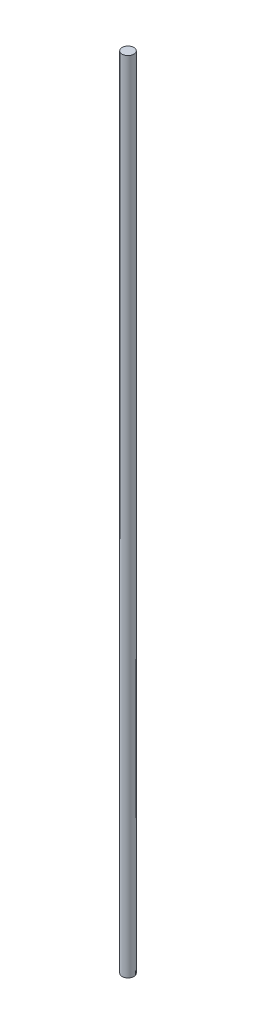
ISO-10303-21;
HEADER;
FILE_DESCRIPTION(('STEP AP214'),'2;1');
FILE_NAME('part.step','',(''),(''),'','','');
FILE_SCHEMA(('AUTOMOTIVE_DESIGN { 1 0 10303 214 1 1 1 1 }'));
ENDSEC;
DATA;
#1=APPLICATION_CONTEXT('core data for automotive mechanical design processes');
#2=APPLICATION_PROTOCOL_DEFINITION('international standard','automotive_design',2000,#1);
#3=PRODUCT_CONTEXT('',#1,'mechanical');
#4=PRODUCT('Part','Part','',(#3));
#5=PRODUCT_RELATED_PRODUCT_CATEGORY('part','',(#4));
#6=PRODUCT_DEFINITION_FORMATION('','',#4);
#7=PRODUCT_DEFINITION_CONTEXT('part definition',#1,'design');
#8=PRODUCT_DEFINITION('design','',#6,#7);
#9=PRODUCT_DEFINITION_SHAPE('','',#8);
#10=(LENGTH_UNIT() NAMED_UNIT(*) SI_UNIT(.MILLI.,.METRE.));
#11=(NAMED_UNIT(*) PLANE_ANGLE_UNIT() SI_UNIT($,.RADIAN.));
#12=(NAMED_UNIT(*) SI_UNIT($,.STERADIAN.) SOLID_ANGLE_UNIT());
#13=UNCERTAINTY_MEASURE_WITH_UNIT(LENGTH_MEASURE(1.E-05),#10,'distance_accuracy_value','');
#14=(GEOMETRIC_REPRESENTATION_CONTEXT(3) GLOBAL_UNCERTAINTY_ASSIGNED_CONTEXT((#13)) GLOBAL_UNIT_ASSIGNED_CONTEXT((#10,
#11,#12)) REPRESENTATION_CONTEXT('',''));
#15=CARTESIAN_POINT('',(0.,0.,0.));
#16=DIRECTION('',(0.,0.,1.));
#17=DIRECTION('',(1.,0.,0.));
#18=AXIS2_PLACEMENT_3D('',#15,#16,#17);
#19=CARTESIAN_POINT('',(0.,-170.,0.));
#20=DIRECTION('',(0.,1.,0.));
#21=DIRECTION('',(0.,0.,1.));
#22=AXIS2_PLACEMENT_3D('',#19,#20,#21);
#23=CYLINDRICAL_SURFACE('',#22,2.5);
#24=CARTESIAN_POINT('',(0.,-170.,0.));
#25=DIRECTION('',(0.,1.,0.));
#26=DIRECTION('',(0.,0.,1.));
#27=AXIS2_PLACEMENT_3D('',#24,#25,#26);
#28=CIRCLE('',#27,2.5);
#29=CARTESIAN_POINT('',(0.,-170.,2.5));
#30=VERTEX_POINT('',#29);
#31=EDGE_CURVE('E10',#30,#30,#28,.T.);
#32=ORIENTED_EDGE('',*,*,#31,.T.);
#33=EDGE_LOOP('',(#32));
#34=FACE_BOUND('',#33,.T.);
#35=CARTESIAN_POINT('',(0.,170.,0.));
#36=DIRECTION('',(0.,1.,0.));
#37=DIRECTION('',(0.,0.,1.));
#38=AXIS2_PLACEMENT_3D('',#35,#36,#37);
#39=CIRCLE('',#38,2.5);
#40=CARTESIAN_POINT('',(0.,170.,2.5));
#41=VERTEX_POINT('',#40);
#42=EDGE_CURVE('E41',#41,#41,#39,.T.);
#43=ORIENTED_EDGE('',*,*,#42,.F.);
#44=EDGE_LOOP('',(#43));
#45=FACE_BOUND('',#44,.T.);
#46=ADVANCED_FACE('F35',(#34,#45),#23,.T.);
#47=CARTESIAN_POINT('',(0.,-170.,0.));
#48=DIRECTION('',(0.,1.,0.));
#49=DIRECTION('',(0.,0.,1.));
#50=AXIS2_PLACEMENT_3D('',#47,#48,#49);
#51=PLANE('',#50);
#52=ORIENTED_EDGE('',*,*,#31,.F.);
#53=EDGE_LOOP('',(#52));
#54=FACE_BOUND('',#53,.T.);
#55=ADVANCED_FACE('F50',(#54),#51,.F.);
#56=CARTESIAN_POINT('',(0.,170.,0.));
#57=DIRECTION('',(0.,1.,0.));
#58=DIRECTION('',(0.,0.,1.));
#59=AXIS2_PLACEMENT_3D('',#56,#57,#58);
#60=PLANE('',#59);
#61=ORIENTED_EDGE('',*,*,#42,.T.);
#62=EDGE_LOOP('',(#61));
#63=FACE_BOUND('',#62,.T.);
#64=ADVANCED_FACE('F47',(#63),#60,.T.);
#65=CLOSED_SHELL('',(#46,#55,#64));
#66=MANIFOLD_SOLID_BREP('B2',#65);
#67=ADVANCED_BREP_SHAPE_REPRESENTATION('',(#18,#66),#14);
#68=SHAPE_DEFINITION_REPRESENTATION(#9,#67);
ENDSEC;
END-ISO-10303-21;
